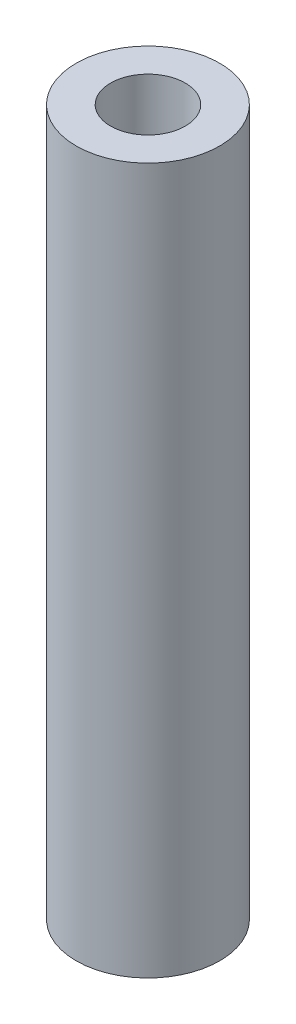
ISO-10303-21;
HEADER;
FILE_DESCRIPTION(('STEP AP214'),'2;1');
FILE_NAME('part.step','',(''),(''),'','','');
FILE_SCHEMA(('AUTOMOTIVE_DESIGN { 1 0 10303 214 1 1 1 1 }'));
ENDSEC;
DATA;
#1=APPLICATION_CONTEXT('core data for automotive mechanical design processes');
#2=APPLICATION_PROTOCOL_DEFINITION('international standard','automotive_design',2000,#1);
#3=PRODUCT_CONTEXT('',#1,'mechanical');
#4=PRODUCT('Part','Part','',(#3));
#5=PRODUCT_RELATED_PRODUCT_CATEGORY('part','',(#4));
#6=PRODUCT_DEFINITION_FORMATION('','',#4);
#7=PRODUCT_DEFINITION_CONTEXT('part definition',#1,'design');
#8=PRODUCT_DEFINITION('design','',#6,#7);
#9=PRODUCT_DEFINITION_SHAPE('','',#8);
#10=(LENGTH_UNIT() NAMED_UNIT(*) SI_UNIT(.MILLI.,.METRE.));
#11=(NAMED_UNIT(*) PLANE_ANGLE_UNIT() SI_UNIT($,.RADIAN.));
#12=(NAMED_UNIT(*) SI_UNIT($,.STERADIAN.) SOLID_ANGLE_UNIT());
#13=UNCERTAINTY_MEASURE_WITH_UNIT(LENGTH_MEASURE(1.E-05),#10,'distance_accuracy_value','');
#14=(GEOMETRIC_REPRESENTATION_CONTEXT(3) GLOBAL_UNCERTAINTY_ASSIGNED_CONTEXT((#13)) GLOBAL_UNIT_ASSIGNED_CONTEXT((#10,
#11,#12)) REPRESENTATION_CONTEXT('',''));
#15=CARTESIAN_POINT('',(0.,0.,0.));
#16=DIRECTION('',(0.,0.,1.));
#17=DIRECTION('',(1.,0.,0.));
#18=AXIS2_PLACEMENT_3D('',#15,#16,#17);
#19=CARTESIAN_POINT('',(0.,15.,0.));
#20=DIRECTION('',(0.,1.,0.));
#21=DIRECTION('',(0.,0.,1.));
#22=AXIS2_PLACEMENT_3D('',#19,#20,#21);
#23=PLANE('',#22);
#24=CARTESIAN_POINT('',(0.,15.,0.));
#25=DIRECTION('',(0.,1.,0.));
#26=DIRECTION('',(0.,0.,1.));
#27=AXIS2_PLACEMENT_3D('',#24,#25,#26);
#28=CIRCLE('',#27,3.05);
#29=CARTESIAN_POINT('',(0.,15.,3.05));
#30=VERTEX_POINT('',#29);
#31=EDGE_CURVE('E10',#30,#30,#28,.T.);
#32=ORIENTED_EDGE('',*,*,#31,.T.);
#33=EDGE_LOOP('',(#32));
#34=FACE_BOUND('',#33,.T.);
#35=CARTESIAN_POINT('',(0.,15.,0.));
#36=DIRECTION('',(0.,1.,0.));
#37=DIRECTION('',(0.,0.,1.));
#38=AXIS2_PLACEMENT_3D('',#35,#36,#37);
#39=CIRCLE('',#38,1.5875);
#40=CARTESIAN_POINT('',(0.,15.,1.5875));
#41=VERTEX_POINT('',#40);
#42=EDGE_CURVE('E41',#41,#41,#39,.T.);
#43=ORIENTED_EDGE('',*,*,#42,.F.);
#44=EDGE_LOOP('',(#43));
#45=FACE_BOUND('',#44,.T.);
#46=ADVANCED_FACE('F30',(#34,#45),#23,.T.);
#47=CARTESIAN_POINT('',(0.,-15.,0.));
#48=DIRECTION('',(0.,1.,0.));
#49=DIRECTION('',(0.,0.,1.));
#50=AXIS2_PLACEMENT_3D('',#47,#48,#49);
#51=PLANE('',#50);
#52=CARTESIAN_POINT('',(0.,-15.,0.));
#53=DIRECTION('',(0.,1.,0.));
#54=DIRECTION('',(0.,0.,1.));
#55=AXIS2_PLACEMENT_3D('',#52,#53,#54);
#56=CIRCLE('',#55,3.05);
#57=CARTESIAN_POINT('',(0.,-15.,3.05));
#58=VERTEX_POINT('',#57);
#59=EDGE_CURVE('E34',#58,#58,#56,.T.);
#60=ORIENTED_EDGE('',*,*,#59,.F.);
#61=EDGE_LOOP('',(#60));
#62=FACE_BOUND('',#61,.T.);
#63=CARTESIAN_POINT('',(0.,-15.,0.));
#64=DIRECTION('',(0.,1.,0.));
#65=DIRECTION('',(0.,0.,1.));
#66=AXIS2_PLACEMENT_3D('',#63,#64,#65);
#67=CIRCLE('',#66,1.5875);
#68=CARTESIAN_POINT('',(0.,-15.,1.5875));
#69=VERTEX_POINT('',#68);
#70=EDGE_CURVE('E43',#69,#69,#67,.T.);
#71=ORIENTED_EDGE('',*,*,#70,.T.);
#72=EDGE_LOOP('',(#71));
#73=FACE_BOUND('',#72,.T.);
#74=ADVANCED_FACE('F53',(#62,#73),#51,.F.);
#75=CARTESIAN_POINT('',(0.,15.,0.));
#76=DIRECTION('',(0.,-1.,0.));
#77=DIRECTION('',(0.,0.,-1.));
#78=AXIS2_PLACEMENT_3D('',#75,#76,#77);
#79=CYLINDRICAL_SURFACE('',#78,3.05);
#80=ORIENTED_EDGE('',*,*,#31,.F.);
#81=EDGE_LOOP('',(#80));
#82=FACE_BOUND('',#81,.T.);
#83=ORIENTED_EDGE('',*,*,#59,.T.);
#84=EDGE_LOOP('',(#83));
#85=FACE_BOUND('',#84,.T.);
#86=ADVANCED_FACE('F32',(#82,#85),#79,.T.);
#87=CARTESIAN_POINT('',(0.,15.,0.));
#88=DIRECTION('',(0.,-1.,0.));
#89=DIRECTION('',(0.,0.,-1.));
#90=AXIS2_PLACEMENT_3D('',#87,#88,#89);
#91=CYLINDRICAL_SURFACE('',#90,1.5875);
#92=ORIENTED_EDGE('',*,*,#42,.T.);
#93=EDGE_LOOP('',(#92));
#94=FACE_BOUND('',#93,.T.);
#95=ORIENTED_EDGE('',*,*,#70,.F.);
#96=EDGE_LOOP('',(#95));
#97=FACE_BOUND('',#96,.T.);
#98=ADVANCED_FACE('F49',(#94,#97),#91,.F.);
#99=CLOSED_SHELL('',(#46,#74,#86,#98));
#100=MANIFOLD_SOLID_BREP('B2',#99);
#101=ADVANCED_BREP_SHAPE_REPRESENTATION('',(#18,#100),#14);
#102=SHAPE_DEFINITION_REPRESENTATION(#9,#101);
ENDSEC;
END-ISO-10303-21;
